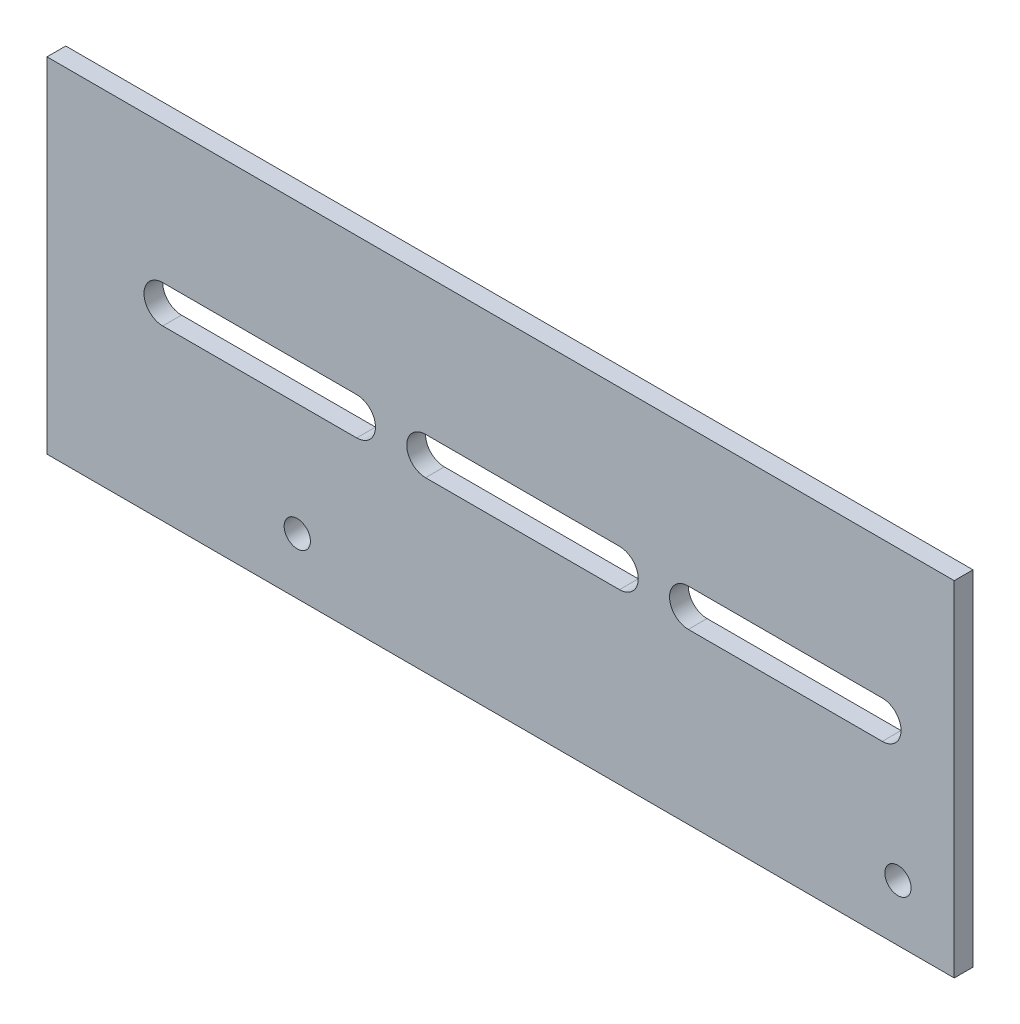
ISO-10303-21;
HEADER;
FILE_DESCRIPTION(('STEP AP214'),'2;1');
FILE_NAME('part.step','',(''),(''),'','','');
FILE_SCHEMA(('AUTOMOTIVE_DESIGN { 1 0 10303 214 1 1 1 1 }'));
ENDSEC;
DATA;
#1=APPLICATION_CONTEXT('core data for automotive mechanical design processes');
#2=APPLICATION_PROTOCOL_DEFINITION('international standard','automotive_design',2000,#1);
#3=PRODUCT_CONTEXT('',#1,'mechanical');
#4=PRODUCT('Part','Part','',(#3));
#5=PRODUCT_RELATED_PRODUCT_CATEGORY('part','',(#4));
#6=PRODUCT_DEFINITION_FORMATION('','',#4);
#7=PRODUCT_DEFINITION_CONTEXT('part definition',#1,'design');
#8=PRODUCT_DEFINITION('design','',#6,#7);
#9=PRODUCT_DEFINITION_SHAPE('','',#8);
#10=(LENGTH_UNIT() NAMED_UNIT(*) SI_UNIT(.MILLI.,.METRE.));
#11=(NAMED_UNIT(*) PLANE_ANGLE_UNIT() SI_UNIT($,.RADIAN.));
#12=(NAMED_UNIT(*) SI_UNIT($,.STERADIAN.) SOLID_ANGLE_UNIT());
#13=UNCERTAINTY_MEASURE_WITH_UNIT(LENGTH_MEASURE(1.E-05),#10,'distance_accuracy_value','');
#14=(GEOMETRIC_REPRESENTATION_CONTEXT(3) GLOBAL_UNCERTAINTY_ASSIGNED_CONTEXT((#13)) GLOBAL_UNIT_ASSIGNED_CONTEXT((#10,
#11,#12)) REPRESENTATION_CONTEXT('',''));
#15=CARTESIAN_POINT('',(0.,0.,0.));
#16=DIRECTION('',(0.,0.,1.));
#17=DIRECTION('',(1.,0.,0.));
#18=AXIS2_PLACEMENT_3D('',#15,#16,#17);
#19=CARTESIAN_POINT('',(0.,0.,3.));
#20=DIRECTION('',(0.,0.,1.));
#21=DIRECTION('',(1.,0.,0.));
#22=AXIS2_PLACEMENT_3D('',#19,#20,#21);
#23=PLANE('',#22);
#24=CARTESIAN_POINT('',(-51.,61.,3.));
#25=DIRECTION('',(0.,0.,1.));
#26=DIRECTION('',(1.,0.,0.));
#27=AXIS2_PLACEMENT_3D('',#24,#25,#26);
#28=CIRCLE('',#27,2.1);
#29=CARTESIAN_POINT('',(-48.9,61.,3.));
#30=VERTEX_POINT('',#29);
#31=EDGE_CURVE('E302',#30,#30,#28,.T.);
#32=ORIENTED_EDGE('',*,*,#31,.F.);
#33=EDGE_LOOP('',(#32));
#34=FACE_BOUND('',#33,.T.);
#35=DIRECTION('',(0.,-1.,0.));
#36=VECTOR('',#35,1.);
#37=CARTESIAN_POINT('',(-91.,107.,3.));
#38=LINE('',#37,#36);
#39=CARTESIAN_POINT('',(-91.,107.,3.));
#40=VERTEX_POINT('',#39);
#41=CARTESIAN_POINT('',(-91.,52.,3.));
#42=VERTEX_POINT('',#41);
#43=EDGE_CURVE('E310',#40,#42,#38,.T.);
#44=ORIENTED_EDGE('',*,*,#43,.T.);
#45=DIRECTION('',(1.,0.,0.));
#46=VECTOR('',#45,1.);
#47=CARTESIAN_POINT('',(-91.,52.,3.));
#48=LINE('',#47,#46);
#49=CARTESIAN_POINT('',(54.,52.,3.));
#50=VERTEX_POINT('',#49);
#51=EDGE_CURVE('E314',#42,#50,#48,.T.);
#52=ORIENTED_EDGE('',*,*,#51,.T.);
#53=DIRECTION('',(0.,1.,0.));
#54=VECTOR('',#53,1.);
#55=CARTESIAN_POINT('',(54.,52.,3.));
#56=LINE('',#55,#54);
#57=CARTESIAN_POINT('',(54.,107.,3.));
#58=VERTEX_POINT('',#57);
#59=EDGE_CURVE('E318',#50,#58,#56,.T.);
#60=ORIENTED_EDGE('',*,*,#59,.T.);
#61=DIRECTION('',(-1.,0.,0.));
#62=VECTOR('',#61,1.);
#63=CARTESIAN_POINT('',(54.,107.,3.));
#64=LINE('',#63,#62);
#65=EDGE_CURVE('E321',#58,#40,#64,.T.);
#66=ORIENTED_EDGE('',*,*,#65,.T.);
#67=EDGE_LOOP('',(#44,#52,#60,#66));
#68=FACE_BOUND('',#67,.T.);
#69=CARTESIAN_POINT('',(45.,61.,3.));
#70=DIRECTION('',(0.,0.,1.));
#71=DIRECTION('',(1.,0.,0.));
#72=AXIS2_PLACEMENT_3D('',#69,#70,#71);
#73=CIRCLE('',#72,2.1);
#74=CARTESIAN_POINT('',(47.1,61.,3.));
#75=VERTEX_POINT('',#74);
#76=EDGE_CURVE('E294',#75,#75,#73,.T.);
#77=ORIENTED_EDGE('',*,*,#76,.F.);
#78=EDGE_LOOP('',(#77));
#79=FACE_BOUND('',#78,.T.);
#80=DIRECTION('',(1.,0.,0.));
#81=VECTOR('',#80,1.);
#82=CARTESIAN_POINT('',(-72.5,79.,3.));
#83=LINE('',#82,#81);
#84=CARTESIAN_POINT('',(-72.5,79.,3.));
#85=VERTEX_POINT('',#84);
#86=CARTESIAN_POINT('',(-41.5,79.,3.));
#87=VERTEX_POINT('',#86);
#88=EDGE_CURVE('E254',#85,#87,#83,.T.);
#89=ORIENTED_EDGE('',*,*,#88,.F.);
#90=CARTESIAN_POINT('',(-72.5,82.,3.));
#91=DIRECTION('',(0.,0.,1.));
#92=DIRECTION('',(1.,0.,0.));
#93=AXIS2_PLACEMENT_3D('',#90,#91,#92);
#94=CIRCLE('',#93,3.);
#95=CARTESIAN_POINT('',(-72.5,85.,3.));
#96=VERTEX_POINT('',#95);
#97=EDGE_CURVE('E251',#96,#85,#94,.T.);
#98=ORIENTED_EDGE('',*,*,#97,.F.);
#99=DIRECTION('',(-1.,0.,0.));
#100=VECTOR('',#99,1.);
#101=CARTESIAN_POINT('',(-41.5,85.,3.));
#102=LINE('',#101,#100);
#103=CARTESIAN_POINT('',(-41.5,85.,3.));
#104=VERTEX_POINT('',#103);
#105=EDGE_CURVE('E262',#104,#96,#102,.T.);
#106=ORIENTED_EDGE('',*,*,#105,.F.);
#107=CARTESIAN_POINT('',(-41.5,82.,3.));
#108=DIRECTION('',(0.,0.,1.));
#109=DIRECTION('',(1.,0.,0.));
#110=AXIS2_PLACEMENT_3D('',#107,#108,#109);
#111=CIRCLE('',#110,3.);
#112=EDGE_CURVE('E258',#87,#104,#111,.T.);
#113=ORIENTED_EDGE('',*,*,#112,.F.);
#114=EDGE_LOOP('',(#89,#98,#106,#113));
#115=FACE_BOUND('',#114,.T.);
#116=DIRECTION('',(1.,0.,0.));
#117=VECTOR('',#116,1.);
#118=CARTESIAN_POINT('',(-30.5,79.,3.));
#119=LINE('',#118,#117);
#120=CARTESIAN_POINT('',(-30.5,79.,3.));
#121=VERTEX_POINT('',#120);
#122=CARTESIAN_POINT('',(0.5,79.,3.));
#123=VERTEX_POINT('',#122);
#124=EDGE_CURVE('E211',#121,#123,#119,.T.);
#125=ORIENTED_EDGE('',*,*,#124,.F.);
#126=CARTESIAN_POINT('',(-30.5,82.,3.));
#127=DIRECTION('',(0.,0.,1.));
#128=DIRECTION('',(1.,0.,0.));
#129=AXIS2_PLACEMENT_3D('',#126,#127,#128);
#130=CIRCLE('',#129,3.);
#131=CARTESIAN_POINT('',(-30.5,85.,3.));
#132=VERTEX_POINT('',#131);
#133=EDGE_CURVE('E208',#132,#121,#130,.T.);
#134=ORIENTED_EDGE('',*,*,#133,.F.);
#135=DIRECTION('',(-1.,0.,0.));
#136=VECTOR('',#135,1.);
#137=CARTESIAN_POINT('',(0.5,85.,3.));
#138=LINE('',#137,#136);
#139=CARTESIAN_POINT('',(0.5,85.,3.));
#140=VERTEX_POINT('',#139);
#141=EDGE_CURVE('E219',#140,#132,#138,.T.);
#142=ORIENTED_EDGE('',*,*,#141,.F.);
#143=CARTESIAN_POINT('',(0.499999999999997,82.,3.));
#144=DIRECTION('',(0.,0.,1.));
#145=DIRECTION('',(1.,0.,0.));
#146=AXIS2_PLACEMENT_3D('',#143,#144,#145);
#147=CIRCLE('',#146,3.);
#148=EDGE_CURVE('E215',#123,#140,#147,.T.);
#149=ORIENTED_EDGE('',*,*,#148,.F.);
#150=EDGE_LOOP('',(#125,#134,#142,#149));
#151=FACE_BOUND('',#150,.T.);
#152=DIRECTION('',(1.,0.,0.));
#153=VECTOR('',#152,1.);
#154=CARTESIAN_POINT('',(11.5,79.,3.));
#155=LINE('',#154,#153);
#156=CARTESIAN_POINT('',(11.5,79.,3.));
#157=VERTEX_POINT('',#156);
#158=CARTESIAN_POINT('',(42.5,79.,3.));
#159=VERTEX_POINT('',#158);
#160=EDGE_CURVE('E168',#157,#159,#155,.T.);
#161=ORIENTED_EDGE('',*,*,#160,.F.);
#162=CARTESIAN_POINT('',(11.5,82.,3.));
#163=DIRECTION('',(0.,0.,1.));
#164=DIRECTION('',(1.,0.,0.));
#165=AXIS2_PLACEMENT_3D('',#162,#163,#164);
#166=CIRCLE('',#165,3.);
#167=CARTESIAN_POINT('',(11.5,85.,3.));
#168=VERTEX_POINT('',#167);
#169=EDGE_CURVE('E159',#168,#157,#166,.T.);
#170=ORIENTED_EDGE('',*,*,#169,.F.);
#171=DIRECTION('',(-1.,0.,0.));
#172=VECTOR('',#171,1.);
#173=CARTESIAN_POINT('',(42.5,85.,3.));
#174=LINE('',#173,#172);
#175=CARTESIAN_POINT('',(42.5,85.,3.));
#176=VERTEX_POINT('',#175);
#177=EDGE_CURVE('E186',#176,#168,#174,.T.);
#178=ORIENTED_EDGE('',*,*,#177,.F.);
#179=CARTESIAN_POINT('',(42.5,82.,3.));
#180=DIRECTION('',(0.,0.,1.));
#181=DIRECTION('',(1.,0.,0.));
#182=AXIS2_PLACEMENT_3D('',#179,#180,#181);
#183=CIRCLE('',#182,3.);
#184=EDGE_CURVE('E181',#159,#176,#183,.T.);
#185=ORIENTED_EDGE('',*,*,#184,.F.);
#186=EDGE_LOOP('',(#161,#170,#178,#185));
#187=FACE_BOUND('',#186,.T.);
#188=ADVANCED_FACE('F45',(#34,#68,#79,#115,#151,#187),#23,.T.);
#189=CARTESIAN_POINT('',(0.,0.,0.));
#190=DIRECTION('',(0.,0.,1.));
#191=DIRECTION('',(1.,0.,0.));
#192=AXIS2_PLACEMENT_3D('',#189,#190,#191);
#193=PLANE('',#192);
#194=CARTESIAN_POINT('',(-30.5,82.,0.));
#195=DIRECTION('',(0.,0.,1.));
#196=DIRECTION('',(1.,0.,0.));
#197=AXIS2_PLACEMENT_3D('',#194,#195,#196);
#198=CIRCLE('',#197,3.);
#199=CARTESIAN_POINT('',(-30.5,85.,0.));
#200=VERTEX_POINT('',#199);
#201=CARTESIAN_POINT('',(-30.5,79.,0.));
#202=VERTEX_POINT('',#201);
#203=EDGE_CURVE('E177',#200,#202,#198,.T.);
#204=ORIENTED_EDGE('',*,*,#203,.T.);
#205=DIRECTION('',(1.,0.,0.));
#206=VECTOR('',#205,1.);
#207=CARTESIAN_POINT('',(-30.5,79.,0.));
#208=LINE('',#207,#206);
#209=CARTESIAN_POINT('',(0.5,79.,0.));
#210=VERTEX_POINT('',#209);
#211=EDGE_CURVE('E226',#202,#210,#208,.T.);
#212=ORIENTED_EDGE('',*,*,#211,.T.);
#213=CARTESIAN_POINT('',(0.499999999999997,82.,0.));
#214=DIRECTION('',(0.,0.,1.));
#215=DIRECTION('',(1.,0.,0.));
#216=AXIS2_PLACEMENT_3D('',#213,#214,#215);
#217=CIRCLE('',#216,3.);
#218=CARTESIAN_POINT('',(0.5,85.,0.));
#219=VERTEX_POINT('',#218);
#220=EDGE_CURVE('E230',#210,#219,#217,.T.);
#221=ORIENTED_EDGE('',*,*,#220,.T.);
#222=DIRECTION('',(-1.,0.,0.));
#223=VECTOR('',#222,1.);
#224=CARTESIAN_POINT('',(0.5,85.,0.));
#225=LINE('',#224,#223);
#226=EDGE_CURVE('E212',#219,#200,#225,.T.);
#227=ORIENTED_EDGE('',*,*,#226,.T.);
#228=EDGE_LOOP('',(#204,#212,#221,#227));
#229=FACE_BOUND('',#228,.T.);
#230=CARTESIAN_POINT('',(45.,61.,0.));
#231=DIRECTION('',(0.,0.,1.));
#232=DIRECTION('',(1.,0.,0.));
#233=AXIS2_PLACEMENT_3D('',#230,#231,#232);
#234=CIRCLE('',#233,2.1);
#235=CARTESIAN_POINT('',(47.1,61.,0.));
#236=VERTEX_POINT('',#235);
#237=EDGE_CURVE('E293',#236,#236,#234,.T.);
#238=ORIENTED_EDGE('',*,*,#237,.T.);
#239=EDGE_LOOP('',(#238));
#240=FACE_BOUND('',#239,.T.);
#241=CARTESIAN_POINT('',(-51.,61.,0.));
#242=DIRECTION('',(0.,0.,1.));
#243=DIRECTION('',(1.,0.,0.));
#244=AXIS2_PLACEMENT_3D('',#241,#242,#243);
#245=CIRCLE('',#244,2.1);
#246=CARTESIAN_POINT('',(-48.9,61.,0.));
#247=VERTEX_POINT('',#246);
#248=EDGE_CURVE('E298',#247,#247,#245,.T.);
#249=ORIENTED_EDGE('',*,*,#248,.T.);
#250=EDGE_LOOP('',(#249));
#251=FACE_BOUND('',#250,.T.);
#252=DIRECTION('',(0.,-1.,0.));
#253=VECTOR('',#252,1.);
#254=CARTESIAN_POINT('',(-91.,107.,0.));
#255=LINE('',#254,#253);
#256=CARTESIAN_POINT('',(-91.,107.,0.));
#257=VERTEX_POINT('',#256);
#258=CARTESIAN_POINT('',(-91.,52.,0.));
#259=VERTEX_POINT('',#258);
#260=EDGE_CURVE('E306',#257,#259,#255,.T.);
#261=ORIENTED_EDGE('',*,*,#260,.F.);
#262=DIRECTION('',(-1.,0.,0.));
#263=VECTOR('',#262,1.);
#264=CARTESIAN_POINT('',(54.,107.,0.));
#265=LINE('',#264,#263);
#266=CARTESIAN_POINT('',(54.,107.,0.));
#267=VERTEX_POINT('',#266);
#268=EDGE_CURVE('E315',#267,#257,#265,.T.);
#269=ORIENTED_EDGE('',*,*,#268,.F.);
#270=DIRECTION('',(0.,1.,0.));
#271=VECTOR('',#270,1.);
#272=CARTESIAN_POINT('',(54.,52.,0.));
#273=LINE('',#272,#271);
#274=CARTESIAN_POINT('',(54.,52.,0.));
#275=VERTEX_POINT('',#274);
#276=EDGE_CURVE('E330',#275,#267,#273,.T.);
#277=ORIENTED_EDGE('',*,*,#276,.F.);
#278=DIRECTION('',(1.,0.,0.));
#279=VECTOR('',#278,1.);
#280=CARTESIAN_POINT('',(-91.,52.,0.));
#281=LINE('',#280,#279);
#282=EDGE_CURVE('E327',#259,#275,#281,.T.);
#283=ORIENTED_EDGE('',*,*,#282,.F.);
#284=EDGE_LOOP('',(#261,#269,#277,#283));
#285=FACE_BOUND('',#284,.T.);
#286=CARTESIAN_POINT('',(-72.5,82.,0.));
#287=DIRECTION('',(0.,0.,1.));
#288=DIRECTION('',(1.,0.,0.));
#289=AXIS2_PLACEMENT_3D('',#286,#287,#288);
#290=CIRCLE('',#289,3.);
#291=CARTESIAN_POINT('',(-72.5,85.,0.));
#292=VERTEX_POINT('',#291);
#293=CARTESIAN_POINT('',(-72.5,79.,0.));
#294=VERTEX_POINT('',#293);
#295=EDGE_CURVE('E250',#292,#294,#290,.T.);
#296=ORIENTED_EDGE('',*,*,#295,.T.);
#297=DIRECTION('',(1.,0.,0.));
#298=VECTOR('',#297,1.);
#299=CARTESIAN_POINT('',(-72.5,79.,0.));
#300=LINE('',#299,#298);
#301=CARTESIAN_POINT('',(-41.5,79.,0.));
#302=VERTEX_POINT('',#301);
#303=EDGE_CURVE('E269',#294,#302,#300,.T.);
#304=ORIENTED_EDGE('',*,*,#303,.T.);
#305=CARTESIAN_POINT('',(-41.5,82.,0.));
#306=DIRECTION('',(0.,0.,1.));
#307=DIRECTION('',(1.,0.,0.));
#308=AXIS2_PLACEMENT_3D('',#305,#306,#307);
#309=CIRCLE('',#308,3.);
#310=CARTESIAN_POINT('',(-41.5,85.,0.));
#311=VERTEX_POINT('',#310);
#312=EDGE_CURVE('E273',#302,#311,#309,.T.);
#313=ORIENTED_EDGE('',*,*,#312,.T.);
#314=DIRECTION('',(-1.,0.,0.));
#315=VECTOR('',#314,1.);
#316=CARTESIAN_POINT('',(-41.5,85.,0.));
#317=LINE('',#316,#315);
#318=EDGE_CURVE('E255',#311,#292,#317,.T.);
#319=ORIENTED_EDGE('',*,*,#318,.T.);
#320=EDGE_LOOP('',(#296,#304,#313,#319));
#321=FACE_BOUND('',#320,.T.);
#322=CARTESIAN_POINT('',(11.5,82.,0.));
#323=DIRECTION('',(0.,0.,1.));
#324=DIRECTION('',(1.,0.,0.));
#325=AXIS2_PLACEMENT_3D('',#322,#323,#324);
#326=CIRCLE('',#325,3.);
#327=CARTESIAN_POINT('',(11.5,85.,0.));
#328=VERTEX_POINT('',#327);
#329=CARTESIAN_POINT('',(11.5,79.,0.));
#330=VERTEX_POINT('',#329);
#331=EDGE_CURVE('E69',#328,#330,#326,.T.);
#332=ORIENTED_EDGE('',*,*,#331,.T.);
#333=DIRECTION('',(1.,0.,0.));
#334=VECTOR('',#333,1.);
#335=CARTESIAN_POINT('',(11.5,79.,0.));
#336=LINE('',#335,#334);
#337=CARTESIAN_POINT('',(42.5,79.,0.));
#338=VERTEX_POINT('',#337);
#339=EDGE_CURVE('E175',#330,#338,#336,.T.);
#340=ORIENTED_EDGE('',*,*,#339,.T.);
#341=CARTESIAN_POINT('',(42.5,82.,0.));
#342=DIRECTION('',(0.,0.,1.));
#343=DIRECTION('',(1.,0.,0.));
#344=AXIS2_PLACEMENT_3D('',#341,#342,#343);
#345=CIRCLE('',#344,3.);
#346=CARTESIAN_POINT('',(42.5,85.,0.));
#347=VERTEX_POINT('',#346);
#348=EDGE_CURVE('E195',#338,#347,#345,.T.);
#349=ORIENTED_EDGE('',*,*,#348,.T.);
#350=DIRECTION('',(-1.,0.,0.));
#351=VECTOR('',#350,1.);
#352=CARTESIAN_POINT('',(42.5,85.,0.));
#353=LINE('',#352,#351);
#354=EDGE_CURVE('E169',#347,#328,#353,.T.);
#355=ORIENTED_EDGE('',*,*,#354,.T.);
#356=EDGE_LOOP('',(#332,#340,#349,#355));
#357=FACE_BOUND('',#356,.T.);
#358=ADVANCED_FACE('F353',(#229,#240,#251,#285,#321,#357),#193,.F.);
#359=CARTESIAN_POINT('',(-91.,107.,3.));
#360=DIRECTION('',(1.,0.,0.));
#361=DIRECTION('',(0.,0.,-1.));
#362=AXIS2_PLACEMENT_3D('',#359,#360,#361);
#363=PLANE('',#362);
#364=ORIENTED_EDGE('',*,*,#260,.T.);
#365=DIRECTION('',(0.,0.,-1.));
#366=VECTOR('',#365,1.);
#367=CARTESIAN_POINT('',(-91.,52.,3.));
#368=LINE('',#367,#366);
#369=EDGE_CURVE('E11',#42,#259,#368,.T.);
#370=ORIENTED_EDGE('',*,*,#369,.F.);
#371=ORIENTED_EDGE('',*,*,#43,.F.);
#372=DIRECTION('',(0.,0.,-1.));
#373=VECTOR('',#372,1.);
#374=CARTESIAN_POINT('',(-91.,107.,3.));
#375=LINE('',#374,#373);
#376=EDGE_CURVE('E323',#40,#257,#375,.T.);
#377=ORIENTED_EDGE('',*,*,#376,.T.);
#378=EDGE_LOOP('',(#364,#370,#371,#377));
#379=FACE_BOUND('',#378,.T.);
#380=ADVANCED_FACE('F47',(#379),#363,.F.);
#381=CARTESIAN_POINT('',(-91.,52.,3.));
#382=DIRECTION('',(0.,1.,0.));
#383=DIRECTION('',(0.,0.,1.));
#384=AXIS2_PLACEMENT_3D('',#381,#382,#383);
#385=PLANE('',#384);
#386=ORIENTED_EDGE('',*,*,#282,.T.);
#387=DIRECTION('',(0.,0.,-1.));
#388=VECTOR('',#387,1.);
#389=CARTESIAN_POINT('',(54.,52.,3.));
#390=LINE('',#389,#388);
#391=EDGE_CURVE('E54',#50,#275,#390,.T.);
#392=ORIENTED_EDGE('',*,*,#391,.F.);
#393=ORIENTED_EDGE('',*,*,#51,.F.);
#394=ORIENTED_EDGE('',*,*,#369,.T.);
#395=EDGE_LOOP('',(#386,#392,#393,#394));
#396=FACE_BOUND('',#395,.T.);
#397=ADVANCED_FACE('F364',(#396),#385,.F.);
#398=CARTESIAN_POINT('',(54.,52.,3.));
#399=DIRECTION('',(-1.,0.,0.));
#400=DIRECTION('',(0.,0.,1.));
#401=AXIS2_PLACEMENT_3D('',#398,#399,#400);
#402=PLANE('',#401);
#403=ORIENTED_EDGE('',*,*,#276,.T.);
#404=DIRECTION('',(0.,0.,-1.));
#405=VECTOR('',#404,1.);
#406=CARTESIAN_POINT('',(54.,107.,3.));
#407=LINE('',#406,#405);
#408=EDGE_CURVE('E338',#58,#267,#407,.T.);
#409=ORIENTED_EDGE('',*,*,#408,.F.);
#410=ORIENTED_EDGE('',*,*,#59,.F.);
#411=ORIENTED_EDGE('',*,*,#391,.T.);
#412=EDGE_LOOP('',(#403,#409,#410,#411));
#413=FACE_BOUND('',#412,.T.);
#414=ADVANCED_FACE('F347',(#413),#402,.F.);
#415=CARTESIAN_POINT('',(54.,107.,3.));
#416=DIRECTION('',(0.,-1.,0.));
#417=DIRECTION('',(0.,0.,-1.));
#418=AXIS2_PLACEMENT_3D('',#415,#416,#417);
#419=PLANE('',#418);
#420=ORIENTED_EDGE('',*,*,#268,.T.);
#421=ORIENTED_EDGE('',*,*,#376,.F.);
#422=ORIENTED_EDGE('',*,*,#65,.F.);
#423=ORIENTED_EDGE('',*,*,#408,.T.);
#424=EDGE_LOOP('',(#420,#421,#422,#423));
#425=FACE_BOUND('',#424,.T.);
#426=ADVANCED_FACE('F357',(#425),#419,.F.);
#427=CARTESIAN_POINT('',(-51.,61.,3.));
#428=DIRECTION('',(0.,0.,-1.));
#429=DIRECTION('',(-1.,0.,0.));
#430=AXIS2_PLACEMENT_3D('',#427,#428,#429);
#431=CYLINDRICAL_SURFACE('',#430,2.1);
#432=ORIENTED_EDGE('',*,*,#31,.T.);
#433=EDGE_LOOP('',(#432));
#434=FACE_BOUND('',#433,.T.);
#435=ORIENTED_EDGE('',*,*,#248,.F.);
#436=EDGE_LOOP('',(#435));
#437=FACE_BOUND('',#436,.T.);
#438=ADVANCED_FACE('F379',(#434,#437),#431,.F.);
#439=CARTESIAN_POINT('',(45.,61.,3.));
#440=DIRECTION('',(0.,0.,-1.));
#441=DIRECTION('',(-1.,0.,0.));
#442=AXIS2_PLACEMENT_3D('',#439,#440,#441);
#443=CYLINDRICAL_SURFACE('',#442,2.1);
#444=ORIENTED_EDGE('',*,*,#76,.T.);
#445=EDGE_LOOP('',(#444));
#446=FACE_BOUND('',#445,.T.);
#447=ORIENTED_EDGE('',*,*,#237,.F.);
#448=EDGE_LOOP('',(#447));
#449=FACE_BOUND('',#448,.T.);
#450=ADVANCED_FACE('F385',(#446,#449),#443,.F.);
#451=CARTESIAN_POINT('',(-72.5,82.,3.));
#452=DIRECTION('',(0.,0.,-1.));
#453=DIRECTION('',(-1.,0.,0.));
#454=AXIS2_PLACEMENT_3D('',#451,#452,#453);
#455=CYLINDRICAL_SURFACE('',#454,3.);
#456=ORIENTED_EDGE('',*,*,#295,.F.);
#457=DIRECTION('',(0.,0.,-1.));
#458=VECTOR('',#457,1.);
#459=CARTESIAN_POINT('',(-72.5,85.,3.));
#460=LINE('',#459,#458);
#461=EDGE_CURVE('E265',#96,#292,#460,.T.);
#462=ORIENTED_EDGE('',*,*,#461,.F.);
#463=ORIENTED_EDGE('',*,*,#97,.T.);
#464=DIRECTION('',(0.,0.,-1.));
#465=VECTOR('',#464,1.);
#466=CARTESIAN_POINT('',(-72.5,79.,3.));
#467=LINE('',#466,#465);
#468=EDGE_CURVE('E289',#85,#294,#467,.T.);
#469=ORIENTED_EDGE('',*,*,#468,.T.);
#470=EDGE_LOOP('',(#456,#462,#463,#469));
#471=FACE_BOUND('',#470,.T.);
#472=ADVANCED_FACE('F389',(#471),#455,.F.);
#473=CARTESIAN_POINT('',(-72.5,79.,3.));
#474=DIRECTION('',(0.,1.,0.));
#475=DIRECTION('',(0.,0.,1.));
#476=AXIS2_PLACEMENT_3D('',#473,#474,#475);
#477=PLANE('',#476);
#478=ORIENTED_EDGE('',*,*,#303,.F.);
#479=ORIENTED_EDGE('',*,*,#468,.F.);
#480=ORIENTED_EDGE('',*,*,#88,.T.);
#481=DIRECTION('',(0.,0.,-1.));
#482=VECTOR('',#481,1.);
#483=CARTESIAN_POINT('',(-41.5,79.,3.));
#484=LINE('',#483,#482);
#485=EDGE_CURVE('E286',#87,#302,#484,.T.);
#486=ORIENTED_EDGE('',*,*,#485,.T.);
#487=EDGE_LOOP('',(#478,#479,#480,#486));
#488=FACE_BOUND('',#487,.T.);
#489=ADVANCED_FACE('F396',(#488),#477,.T.);
#490=CARTESIAN_POINT('',(-41.5,82.,3.));
#491=DIRECTION('',(0.,0.,-1.));
#492=DIRECTION('',(-1.,0.,0.));
#493=AXIS2_PLACEMENT_3D('',#490,#491,#492);
#494=CYLINDRICAL_SURFACE('',#493,3.);
#495=ORIENTED_EDGE('',*,*,#312,.F.);
#496=ORIENTED_EDGE('',*,*,#485,.F.);
#497=ORIENTED_EDGE('',*,*,#112,.T.);
#498=DIRECTION('',(0.,0.,-1.));
#499=VECTOR('',#498,1.);
#500=CARTESIAN_POINT('',(-41.5,85.,3.));
#501=LINE('',#500,#499);
#502=EDGE_CURVE('E283',#104,#311,#501,.T.);
#503=ORIENTED_EDGE('',*,*,#502,.T.);
#504=EDGE_LOOP('',(#495,#496,#497,#503));
#505=FACE_BOUND('',#504,.T.);
#506=ADVANCED_FACE('F403',(#505),#494,.F.);
#507=CARTESIAN_POINT('',(-41.5,85.,3.));
#508=DIRECTION('',(0.,-1.,0.));
#509=DIRECTION('',(0.,0.,-1.));
#510=AXIS2_PLACEMENT_3D('',#507,#508,#509);
#511=PLANE('',#510);
#512=ORIENTED_EDGE('',*,*,#318,.F.);
#513=ORIENTED_EDGE('',*,*,#502,.F.);
#514=ORIENTED_EDGE('',*,*,#105,.T.);
#515=ORIENTED_EDGE('',*,*,#461,.T.);
#516=EDGE_LOOP('',(#512,#513,#514,#515));
#517=FACE_BOUND('',#516,.T.);
#518=ADVANCED_FACE('F407',(#517),#511,.T.);
#519=CARTESIAN_POINT('',(-30.5,82.,3.));
#520=DIRECTION('',(0.,0.,-1.));
#521=DIRECTION('',(-1.,0.,0.));
#522=AXIS2_PLACEMENT_3D('',#519,#520,#521);
#523=CYLINDRICAL_SURFACE('',#522,3.);
#524=ORIENTED_EDGE('',*,*,#203,.F.);
#525=DIRECTION('',(0.,0.,-1.));
#526=VECTOR('',#525,1.);
#527=CARTESIAN_POINT('',(-30.5,85.,3.));
#528=LINE('',#527,#526);
#529=EDGE_CURVE('E222',#132,#200,#528,.T.);
#530=ORIENTED_EDGE('',*,*,#529,.F.);
#531=ORIENTED_EDGE('',*,*,#133,.T.);
#532=DIRECTION('',(0.,0.,-1.));
#533=VECTOR('',#532,1.);
#534=CARTESIAN_POINT('',(-30.5,79.,3.));
#535=LINE('',#534,#533);
#536=EDGE_CURVE('E246',#121,#202,#535,.T.);
#537=ORIENTED_EDGE('',*,*,#536,.T.);
#538=EDGE_LOOP('',(#524,#530,#531,#537));
#539=FACE_BOUND('',#538,.T.);
#540=ADVANCED_FACE('F411',(#539),#523,.F.);
#541=CARTESIAN_POINT('',(-30.5,79.,3.));
#542=DIRECTION('',(0.,1.,0.));
#543=DIRECTION('',(0.,0.,1.));
#544=AXIS2_PLACEMENT_3D('',#541,#542,#543);
#545=PLANE('',#544);
#546=ORIENTED_EDGE('',*,*,#211,.F.);
#547=ORIENTED_EDGE('',*,*,#536,.F.);
#548=ORIENTED_EDGE('',*,*,#124,.T.);
#549=DIRECTION('',(0.,0.,-1.));
#550=VECTOR('',#549,1.);
#551=CARTESIAN_POINT('',(0.5,79.,3.));
#552=LINE('',#551,#550);
#553=EDGE_CURVE('E243',#123,#210,#552,.T.);
#554=ORIENTED_EDGE('',*,*,#553,.T.);
#555=EDGE_LOOP('',(#546,#547,#548,#554));
#556=FACE_BOUND('',#555,.T.);
#557=ADVANCED_FACE('F415',(#556),#545,.T.);
#558=CARTESIAN_POINT('',(0.499999999999997,82.,3.));
#559=DIRECTION('',(0.,0.,-1.));
#560=DIRECTION('',(-1.,0.,0.));
#561=AXIS2_PLACEMENT_3D('',#558,#559,#560);
#562=CYLINDRICAL_SURFACE('',#561,3.);
#563=ORIENTED_EDGE('',*,*,#220,.F.);
#564=ORIENTED_EDGE('',*,*,#553,.F.);
#565=ORIENTED_EDGE('',*,*,#148,.T.);
#566=DIRECTION('',(0.,0.,-1.));
#567=VECTOR('',#566,1.);
#568=CARTESIAN_POINT('',(0.5,85.,3.));
#569=LINE('',#568,#567);
#570=EDGE_CURVE('E240',#140,#219,#569,.T.);
#571=ORIENTED_EDGE('',*,*,#570,.T.);
#572=EDGE_LOOP('',(#563,#564,#565,#571));
#573=FACE_BOUND('',#572,.T.);
#574=ADVANCED_FACE('F419',(#573),#562,.F.);
#575=CARTESIAN_POINT('',(0.5,85.,3.));
#576=DIRECTION('',(0.,-1.,0.));
#577=DIRECTION('',(0.,0.,-1.));
#578=AXIS2_PLACEMENT_3D('',#575,#576,#577);
#579=PLANE('',#578);
#580=ORIENTED_EDGE('',*,*,#226,.F.);
#581=ORIENTED_EDGE('',*,*,#570,.F.);
#582=ORIENTED_EDGE('',*,*,#141,.T.);
#583=ORIENTED_EDGE('',*,*,#529,.T.);
#584=EDGE_LOOP('',(#580,#581,#582,#583));
#585=FACE_BOUND('',#584,.T.);
#586=ADVANCED_FACE('F423',(#585),#579,.T.);
#587=CARTESIAN_POINT('',(11.5,82.,3.));
#588=DIRECTION('',(0.,0.,-1.));
#589=DIRECTION('',(-1.,0.,0.));
#590=AXIS2_PLACEMENT_3D('',#587,#588,#589);
#591=CYLINDRICAL_SURFACE('',#590,3.);
#592=ORIENTED_EDGE('',*,*,#331,.F.);
#593=DIRECTION('',(0.,0.,-1.));
#594=VECTOR('',#593,1.);
#595=CARTESIAN_POINT('',(11.5,85.,3.));
#596=LINE('',#595,#594);
#597=EDGE_CURVE('E163',#168,#328,#596,.T.);
#598=ORIENTED_EDGE('',*,*,#597,.F.);
#599=ORIENTED_EDGE('',*,*,#169,.T.);
#600=DIRECTION('',(0.,0.,-1.));
#601=VECTOR('',#600,1.);
#602=CARTESIAN_POINT('',(11.5,79.,3.));
#603=LINE('',#602,#601);
#604=EDGE_CURVE('E162',#157,#330,#603,.T.);
#605=ORIENTED_EDGE('',*,*,#604,.T.);
#606=EDGE_LOOP('',(#592,#598,#599,#605));
#607=FACE_BOUND('',#606,.T.);
#608=ADVANCED_FACE('F161',(#607),#591,.F.);
#609=CARTESIAN_POINT('',(11.5,79.,3.));
#610=DIRECTION('',(0.,1.,0.));
#611=DIRECTION('',(0.,0.,1.));
#612=AXIS2_PLACEMENT_3D('',#609,#610,#611);
#613=PLANE('',#612);
#614=ORIENTED_EDGE('',*,*,#339,.F.);
#615=ORIENTED_EDGE('',*,*,#604,.F.);
#616=ORIENTED_EDGE('',*,*,#160,.T.);
#617=DIRECTION('',(0.,0.,-1.));
#618=VECTOR('',#617,1.);
#619=CARTESIAN_POINT('',(42.5,79.,3.));
#620=LINE('',#619,#618);
#621=EDGE_CURVE('E178',#159,#338,#620,.T.);
#622=ORIENTED_EDGE('',*,*,#621,.T.);
#623=EDGE_LOOP('',(#614,#615,#616,#622));
#624=FACE_BOUND('',#623,.T.);
#625=ADVANCED_FACE('F172',(#624),#613,.T.);
#626=CARTESIAN_POINT('',(42.5,82.,3.));
#627=DIRECTION('',(0.,0.,-1.));
#628=DIRECTION('',(-1.,0.,0.));
#629=AXIS2_PLACEMENT_3D('',#626,#627,#628);
#630=CYLINDRICAL_SURFACE('',#629,3.);
#631=ORIENTED_EDGE('',*,*,#348,.F.);
#632=ORIENTED_EDGE('',*,*,#621,.F.);
#633=ORIENTED_EDGE('',*,*,#184,.T.);
#634=DIRECTION('',(0.,0.,-1.));
#635=VECTOR('',#634,1.);
#636=CARTESIAN_POINT('',(42.5,85.,3.));
#637=LINE('',#636,#635);
#638=EDGE_CURVE('E61',#176,#347,#637,.T.);
#639=ORIENTED_EDGE('',*,*,#638,.T.);
#640=EDGE_LOOP('',(#631,#632,#633,#639));
#641=FACE_BOUND('',#640,.T.);
#642=ADVANCED_FACE('F432',(#641),#630,.F.);
#643=CARTESIAN_POINT('',(42.5,85.,3.));
#644=DIRECTION('',(0.,-1.,0.));
#645=DIRECTION('',(0.,0.,-1.));
#646=AXIS2_PLACEMENT_3D('',#643,#644,#645);
#647=PLANE('',#646);
#648=ORIENTED_EDGE('',*,*,#354,.F.);
#649=ORIENTED_EDGE('',*,*,#638,.F.);
#650=ORIENTED_EDGE('',*,*,#177,.T.);
#651=ORIENTED_EDGE('',*,*,#597,.T.);
#652=EDGE_LOOP('',(#648,#649,#650,#651));
#653=FACE_BOUND('',#652,.T.);
#654=ADVANCED_FACE('F435',(#653),#647,.T.);
#655=CLOSED_SHELL('',(#188,#358,#380,#397,#414,#426,#438,#450,#472,#489,#506,#518,#540,#557,
#574,#586,#608,#625,#642,#654));
#656=MANIFOLD_SOLID_BREP('B2',#655);
#657=ADVANCED_BREP_SHAPE_REPRESENTATION('',(#18,#656),#14);
#658=SHAPE_DEFINITION_REPRESENTATION(#9,#657);
ENDSEC;
END-ISO-10303-21;
